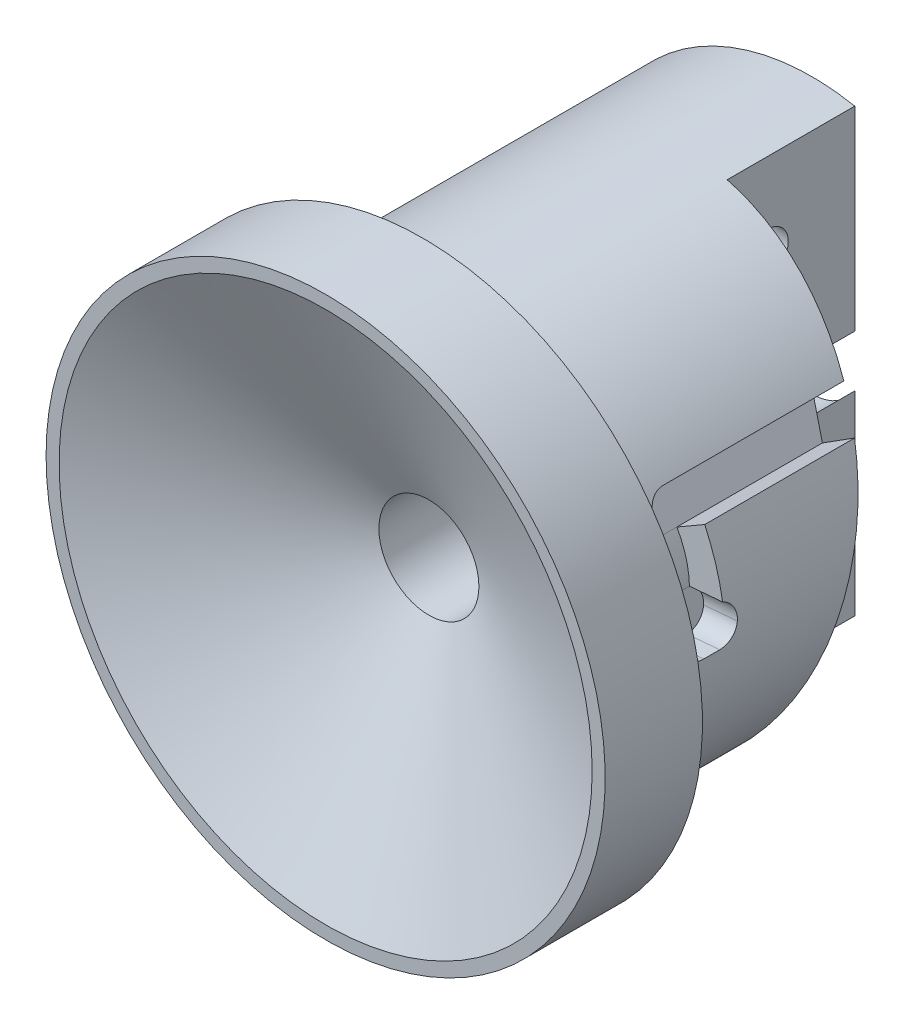
ISO-10303-21;
HEADER;
FILE_DESCRIPTION(('STEP AP214'),'2;1');
FILE_NAME('part.step','',(''),(''),'','','');
FILE_SCHEMA(('AUTOMOTIVE_DESIGN { 1 0 10303 214 1 1 1 1 }'));
ENDSEC;
DATA;
#1=APPLICATION_CONTEXT('core data for automotive mechanical design processes');
#2=APPLICATION_PROTOCOL_DEFINITION('international standard','automotive_design',2000,#1);
#3=PRODUCT_CONTEXT('',#1,'mechanical');
#4=PRODUCT('Part','Part','',(#3));
#5=PRODUCT_RELATED_PRODUCT_CATEGORY('part','',(#4));
#6=PRODUCT_DEFINITION_FORMATION('','',#4);
#7=PRODUCT_DEFINITION_CONTEXT('part definition',#1,'design');
#8=PRODUCT_DEFINITION('design','',#6,#7);
#9=PRODUCT_DEFINITION_SHAPE('','',#8);
#10=(LENGTH_UNIT() NAMED_UNIT(*) SI_UNIT(.MILLI.,.METRE.));
#11=(NAMED_UNIT(*) PLANE_ANGLE_UNIT() SI_UNIT($,.RADIAN.));
#12=(NAMED_UNIT(*) SI_UNIT($,.STERADIAN.) SOLID_ANGLE_UNIT());
#13=UNCERTAINTY_MEASURE_WITH_UNIT(LENGTH_MEASURE(1.E-05),#10,'distance_accuracy_value','');
#14=(GEOMETRIC_REPRESENTATION_CONTEXT(3) GLOBAL_UNCERTAINTY_ASSIGNED_CONTEXT((#13)) GLOBAL_UNIT_ASSIGNED_CONTEXT((#10,
#11,#12)) REPRESENTATION_CONTEXT('',''));
#15=CARTESIAN_POINT('',(0.,0.,0.));
#16=DIRECTION('',(0.,0.,1.));
#17=DIRECTION('',(1.,0.,0.));
#18=AXIS2_PLACEMENT_3D('',#15,#16,#17);
#19=CARTESIAN_POINT('',(12.4163792441114,1.08629242589841,-11.43));
#20=DIRECTION('',(-0.996194698091745,-0.0871557427476648,0.));
#21=DIRECTION('',(0.0871557427476648,-0.996194698091745,0.));
#22=AXIS2_PLACEMENT_3D('',#19,#20,#21);
#23=PLANE('',#22);
#24=DIRECTION('',(0.,0.,1.));
#25=VECTOR('',#24,1.);
#26=CARTESIAN_POINT('',(12.5303876711996,-0.216829858675404,-11.43));
#27=LINE('',#26,#25);
#28=CARTESIAN_POINT('',(12.5303876711996,-0.216829858675404,-11.0477431507776));
#29=VERTEX_POINT('',#28);
#30=CARTESIAN_POINT('',(12.5303876711996,-0.216829858675404,-10.0076));
#31=VERTEX_POINT('',#30);
#32=EDGE_CURVE('E184',#29,#31,#27,.T.);
#33=ORIENTED_EDGE('',*,*,#32,.F.);
#34=CARTESIAN_POINT('',(12.4263411455075,0.972427371906513,-11.0477431507776));
#35=DIRECTION('',(-0.996194698091745,-0.0871557427476648,0.));
#36=DIRECTION('',(0.0871557427476648,-0.996194698091745,0.));
#37=AXIS2_PLACEMENT_3D('',#34,#35,#36);
#38=CIRCLE('',#37,1.1938);
#39=CARTESIAN_POINT('',(12.4417284972035,0.796549137220463,-12.2284160588988));
#40=VERTEX_POINT('',#39);
#41=EDGE_CURVE('E60',#29,#40,#38,.F.);
#42=ORIENTED_EDGE('',*,*,#41,.T.);
#43=CARTESIAN_POINT('',(12.4248678884302,0.989266777355177,-10.9347));
#44=DIRECTION('',(0.996194698091745,0.0871557427476654,0.));
#45=DIRECTION('',(-0.0871557427476654,0.996194698091745,0.));
#46=AXIS2_PLACEMENT_3D('',#43,#44,#45);
#47=CIRCLE('',#46,1.3081);
#48=CARTESIAN_POINT('',(12.3193481056608,2.19536341338579,-11.43));
#49=VERTEX_POINT('',#48);
#50=EDGE_CURVE('E178',#40,#49,#47,.T.);
#51=ORIENTED_EDGE('',*,*,#50,.T.);
#52=DIRECTION('',(0.,0.,-1.));
#53=VECTOR('',#52,1.);
#54=CARTESIAN_POINT('',(12.3193481056608,2.19536341338579,-4.98224669027091));
#55=LINE('',#54,#53);
#56=CARTESIAN_POINT('',(12.3193481056608,2.19536341338579,-8.8138));
#57=VERTEX_POINT('',#56);
#58=EDGE_CURVE('E625',#57,#49,#55,.T.);
#59=ORIENTED_EDGE('',*,*,#58,.F.);
#60=DIRECTION('',(0.0871557427476648,-0.996194698091745,0.));
#61=VECTOR('',#60,1.);
#62=CARTESIAN_POINT('',(12.4163792441114,1.08629242589841,-8.8138));
#63=LINE('',#62,#61);
#64=CARTESIAN_POINT('',(12.4263411455075,0.972427371906522,-8.8138));
#65=VERTEX_POINT('',#64);
#66=EDGE_CURVE('E169',#57,#65,#63,.T.);
#67=ORIENTED_EDGE('',*,*,#66,.T.);
#68=CARTESIAN_POINT('',(12.4263411455075,0.972427371906522,-10.0076));
#69=DIRECTION('',(-0.996194698091745,-0.0871557427476648,0.));
#70=DIRECTION('',(0.0871557427476648,-0.996194698091745,0.));
#71=AXIS2_PLACEMENT_3D('',#68,#69,#70);
#72=CIRCLE('',#71,1.1938);
#73=EDGE_CURVE('E285',#65,#31,#72,.F.);
#74=ORIENTED_EDGE('',*,*,#73,.T.);
#75=EDGE_LOOP('',(#33,#42,#51,#59,#67,#74));
#76=FACE_BOUND('',#75,.T.);
#77=ADVANCED_FACE('F46',(#76),#23,.F.);
#78=CARTESIAN_POINT('',(0.,0.,-0.325495880631441));
#79=DIRECTION('',(0.,0.,-1.));
#80=DIRECTION('',(-1.,0.,0.));
#81=AXIS2_PLACEMENT_3D('',#78,#79,#80);
#82=CYLINDRICAL_SURFACE('',#81,14.6812);
#83=CARTESIAN_POINT('',(0.,0.,-6.35));
#84=DIRECTION('',(0.,0.,-1.));
#85=DIRECTION('',(-1.,0.,0.));
#86=AXIS2_PLACEMENT_3D('',#83,#84,#85);
#87=CIRCLE('',#86,14.6812);
#88=CARTESIAN_POINT('',(-14.6812,0.,-6.35));
#89=VERTEX_POINT('',#88);
#90=EDGE_CURVE('E246',#89,#89,#87,.T.);
#91=ORIENTED_EDGE('',*,*,#90,.T.);
#92=EDGE_LOOP('',(#91));
#93=FACE_BOUND('',#92,.T.);
#94=CARTESIAN_POINT('',(0.,0.,-11.43));
#95=DIRECTION('',(0.,0.,-1.));
#96=DIRECTION('',(-1.,0.,0.));
#97=AXIS2_PLACEMENT_3D('',#94,#95,#96);
#98=CIRCLE('',#97,14.6812);
#99=CARTESIAN_POINT('',(13.3177730257338,6.17855606715985,-11.43));
#100=VERTEX_POINT('',#99);
#101=CARTESIAN_POINT('',(14.4861901964781,2.3849375319831,-11.43));
#102=VERTEX_POINT('',#101);
#103=EDGE_CURVE('E174',#100,#102,#98,.T.);
#104=ORIENTED_EDGE('',*,*,#103,.T.);
#105=CARTESIAN_POINT('',(14.4861901964781,2.3849375319831,-11.43));
#106=CARTESIAN_POINT('',(14.4884613639518,2.37113892146036,-11.4640839324803));
#107=CARTESIAN_POINT('',(14.4909469978515,2.35592163119562,-11.4975599355647));
#108=CARTESIAN_POINT('',(14.4963016066078,2.32274827648895,-11.5630917175754));
#109=CARTESIAN_POINT('',(14.4991705585478,2.30479237576407,-11.5951475812514));
#110=CARTESIAN_POINT('',(14.5082748069592,2.24702314199613,-11.6887851744347));
#111=CARTESIAN_POINT('',(14.5150150036987,2.2032637948891,-11.7479464938295));
#112=CARTESIAN_POINT('',(14.5293750070234,2.10648592639315,-11.8580031221646));
#113=CARTESIAN_POINT('',(14.5369951813185,2.0534635295405,-11.9088949540572));
#114=CARTESIAN_POINT('',(14.5526203993969,1.93963040528132,-12.0009804680014));
#115=CARTESIAN_POINT('',(14.5606253725657,1.87882110346975,-12.0421759213184));
#116=CARTESIAN_POINT('',(14.576537633485,1.75109152865624,-12.1137040439891));
#117=CARTESIAN_POINT('',(14.5844449014716,1.68417004152981,-12.1440345492142));
#118=CARTESIAN_POINT('',(14.5997272511608,1.54609767566489,-12.1929541419579));
#119=CARTESIAN_POINT('',(14.607102277394,1.47494635750507,-12.2115420072372));
#120=CARTESIAN_POINT('',(14.6209501884581,1.33066995216013,-12.2363920347503));
#121=CARTESIAN_POINT('',(14.6274258299262,1.25755175459766,-12.2426926683214));
#122=CARTESIAN_POINT('',(14.6392703996066,1.11120858960278,-12.2429046032492));
#123=CARTESIAN_POINT('',(14.6446393414138,1.03798362349305,-12.2368160568067));
#124=CARTESIAN_POINT('',(14.6541548947385,0.893645242462607,-12.2124528028116));
#125=CARTESIAN_POINT('',(14.6583036793869,0.822528278854515,-12.1941999519649));
#126=CARTESIAN_POINT('',(14.6654071916949,0.684294374417719,-12.1460628447409));
#127=CARTESIAN_POINT('',(14.6683620518004,0.61717699060737,-12.1161798792521));
#128=CARTESIAN_POINT('',(14.6732064954826,0.488666124884252,-12.0455416585469));
#129=CARTESIAN_POINT('',(14.6750933912915,0.427287406482897,-12.0047593487301));
#130=CARTESIAN_POINT('',(14.6779937408499,0.312178358820198,-11.9135124207659));
#131=CARTESIAN_POINT('',(14.6790070080101,0.258449665492134,-11.8630457370473));
#132=CARTESIAN_POINT('',(14.6804218904452,0.159245895251082,-11.7527841678264));
#133=CARTESIAN_POINT('',(14.680811807414,0.113942466276904,-11.692833569748));
#134=CARTESIAN_POINT('',(14.6811136624675,0.0541648994216365,-11.5978162464266));
#135=CARTESIAN_POINT('',(14.6811670302523,0.0355888327049288,-11.5652633572206));
#136=CARTESIAN_POINT('',(14.6812098056202,0.00129355360213024,-11.498683736804));
#137=CARTESIAN_POINT('',(14.6811992098185,-0.014425507549017,-11.4646569276898));
#138=CARTESIAN_POINT('',(14.6811720243797,-0.028660610083196,-11.43));
#139=B_SPLINE_CURVE_WITH_KNOTS('',3,(#105,#106,#107,#108,#109,#110,#111,#112,#113,#114,#115,
#116,#117,#118,#119,#120,#121,#122,#123,#124,#125,#126,#127,#128,#129,#130,#131,#132,#133,#134,
#135,#136,#137,#138),.UNSPECIFIED.,.F.,.F.,(4,2,2,2,2,2,2,2,2,2,2,2,2,2,2,2,4),(0.,
0.110455309405497,0.22090401826105,0.441450437625067,0.662089350884358,0.882687928062333,
1.10333042064266,1.3239958751392,1.5439693094908,1.76394004148966,1.98351659398571,
2.20306878145643,2.42317109112525,2.64332039849976,2.86755466092752,2.97987594788759,
3.09220317881903),.UNSPECIFIED.);
#140=CARTESIAN_POINT('',(14.6478125129356,0.989556479382784,-12.2284160588988));
#141=VERTEX_POINT('',#140);
#142=EDGE_CURVE('E160',#102,#141,#139,.T.);
#143=ORIENTED_EDGE('',*,*,#142,.T.);
#144=CARTESIAN_POINT('',(14.6478125129356,0.989556479382784,-12.2284160588988));
#145=CARTESIAN_POINT('',(14.6500520617752,0.956414885802688,-12.2234497719461));
#146=CARTESIAN_POINT('',(14.6521625740862,0.923490699329103,-12.2170844377252));
#147=CARTESIAN_POINT('',(14.6561266797544,0.858282230564713,-12.2016024279582));
#148=CARTESIAN_POINT('',(14.6579802900503,0.825997906205256,-12.1924859339349));
#149=CARTESIAN_POINT('',(14.6631521672888,0.730511927722907,-12.1611134422584));
#150=CARTESIAN_POINT('',(14.6660889302212,0.668565530487546,-12.1348175692463));
#151=CARTESIAN_POINT('',(14.6710176288004,0.549922268249114,-12.0722187251337));
#152=CARTESIAN_POINT('',(14.6730091760995,0.493227568624937,-12.0359116505367));
#153=CARTESIAN_POINT('',(14.6762031903628,0.38669701296365,-11.9543239944428));
#154=CARTESIAN_POINT('',(14.6774058468479,0.336859511848389,-11.9090455716021));
#155=CARTESIAN_POINT('',(14.6792209558788,0.245374594432259,-11.8106954776694));
#156=CARTESIAN_POINT('',(14.6798323334249,0.203742204744798,-11.7576098133281));
#157=CARTESIAN_POINT('',(14.680671372986,0.129958071030313,-11.6451657160257));
#158=CARTESIAN_POINT('',(14.680898820731,0.0978116293300162,-11.5858037999342));
#159=CARTESIAN_POINT('',(14.6811588607807,0.043971541156054,-11.4625272929247));
#160=CARTESIAN_POINT('',(14.681191469244,0.0222770279981484,-11.3986130799922));
#161=CARTESIAN_POINT('',(14.6812059558936,-0.00998039306510226,-11.268137439148));
#162=CARTESIAN_POINT('',(14.6811879344012,-0.0205652571984908,-11.2015815034751));
#163=CARTESIAN_POINT('',(14.6811735472856,-0.0276040131707234,-11.1057329463568));
#164=CARTESIAN_POINT('',(14.6811706958382,-0.0286684031172335,-11.0767298307041));
#165=CARTESIAN_POINT('',(14.6811720243797,-0.0286606100832027,-11.0477431507776));
#166=B_SPLINE_CURVE_WITH_KNOTS('',3,(#144,#145,#146,#147,#148,#149,#150,#151,#152,#153,#154,
#155,#156,#157,#158,#159,#160,#161,#162,#163,#164,#165),.UNSPECIFIED.,.F.,.F.,(4,2,2,2,2,2,2,2,
2,2,4),(0.,0.100696848378733,0.201387054188759,0.402432056561508,0.603559588185072,
0.804638783804235,1.00608287651422,1.20763935734326,1.40917912203195,1.61031982519953,
1.69730434377564),.UNSPECIFIED.);
#167=CARTESIAN_POINT('',(14.6811720243797,-0.0286606100831969,-11.0477431507776));
#168=VERTEX_POINT('',#167);
#169=EDGE_CURVE('E13',#141,#168,#166,.T.);
#170=ORIENTED_EDGE('',*,*,#169,.T.);
#171=DIRECTION('',(0.,0.,1.));
#172=VECTOR('',#171,1.);
#173=CARTESIAN_POINT('',(14.6811720243797,-0.0286606100831969,-11.43));
#174=LINE('',#173,#172);
#175=CARTESIAN_POINT('',(14.6811720243797,-0.0286606100831969,-10.0076));
#176=VERTEX_POINT('',#175);
#177=EDGE_CURVE('E186',#168,#176,#174,.T.);
#178=ORIENTED_EDGE('',*,*,#177,.T.);
#179=CARTESIAN_POINT('',(14.6811720243797,-0.0286606100831969,-10.0076));
#180=CARTESIAN_POINT('',(14.6811713603819,-0.0286605230438289,-9.97408563546251));
#181=CARTESIAN_POINT('',(14.6811748663989,-0.0272427717737959,-9.94058738885749));
#182=CARTESIAN_POINT('',(14.6811845304353,-0.0215876829205685,-9.8738318693208));
#183=CARTESIAN_POINT('',(14.68119068829,-0.0173505205160749,-9.84057458154739));
#184=CARTESIAN_POINT('',(14.6812045930233,-0.000453664150254155,-9.74159048510479));
#185=CARTESIAN_POINT('',(14.6812078098013,0.0163915308899458,-9.67652869935269));
#186=CARTESIAN_POINT('',(14.6810908383812,0.0607567027563818,-9.55016116036319));
#187=CARTESIAN_POINT('',(14.6809705991541,0.0882810907647501,-9.48885697138397));
#188=CARTESIAN_POINT('',(14.6804363890432,0.153200837694031,-9.37172124193255));
#189=CARTESIAN_POINT('',(14.6800224525708,0.190595039879959,-9.31588906119583));
#190=CARTESIAN_POINT('',(14.6786972688968,0.274281353774743,-9.21113424513901));
#191=CARTESIAN_POINT('',(14.6777848159165,0.320594862330806,-9.16222872618486));
#192=CARTESIAN_POINT('',(14.6752549436024,0.42074894096606,-9.07284954191489));
#193=CARTESIAN_POINT('',(14.6736373854947,0.474590991341006,-9.03237753874161));
#194=CARTESIAN_POINT('',(14.6695155823306,0.588380160054187,-8.96094395595983));
#195=CARTESIAN_POINT('',(14.6670094195741,0.648340280904667,-8.93000321783209));
#196=CARTESIAN_POINT('',(14.6609910764105,0.772547009819359,-8.87865031721457));
#197=CARTESIAN_POINT('',(14.6574795068623,0.836790996991481,-8.85823178273492));
#198=CARTESIAN_POINT('',(14.6507889416689,0.945461627073592,-8.83354305630054));
#199=CARTESIAN_POINT('',(14.6479009496125,0.989221128629121,-8.82614487763141));
#200=CARTESIAN_POINT('',(14.6416949748365,1.07720193868941,-8.81627361018692));
#201=CARTESIAN_POINT('',(14.6383775752617,1.12142254745402,-8.81379391522364));
#202=CARTESIAN_POINT('',(14.6348522499863,1.16564705681955,-8.8138));
#203=B_SPLINE_CURVE_WITH_KNOTS('',3,(#179,#180,#181,#182,#183,#184,#185,#186,#187,#188,#189,
#190,#191,#192,#193,#194,#195,#196,#197,#198,#199,#200,#201,#202),.UNSPECIFIED.,.F.,.F.,(4,2,2,
2,2,2,2,2,2,2,2,4),(0.,0.10048113671173,0.200956030803738,0.401542288075423,0.602211488518851,
0.8028571811141,1.00399034458768,1.20516311152662,1.40677269924674,1.60826005322121,
1.74142420625145,1.87440938039694),.UNSPECIFIED.);
#204=CARTESIAN_POINT('',(14.6348522499863,1.16564705681955,-8.8138));
#205=VERTEX_POINT('',#204);
#206=EDGE_CURVE('E295',#176,#205,#203,.T.);
#207=ORIENTED_EDGE('',*,*,#206,.T.);
#208=CARTESIAN_POINT('',(0.,0.,-8.8138));
#209=DIRECTION('',(0.,0.,-1.));
#210=DIRECTION('',(-1.,0.,0.));
#211=AXIS2_PLACEMENT_3D('',#208,#209,#210);
#212=CIRCLE('',#211,14.6812);
#213=CARTESIAN_POINT('',(12.6567568233372,7.43936423055812,-8.8138));
#214=VERTEX_POINT('',#213);
#215=EDGE_CURVE('E198',#205,#214,#212,.F.);
#216=ORIENTED_EDGE('',*,*,#215,.T.);
#217=CARTESIAN_POINT('',(12.6567568233372,7.43936423055812,-8.8138));
#218=CARTESIAN_POINT('',(12.6397597788737,7.46828295212252,-8.81380015810687));
#219=CARTESIAN_POINT('',(12.6226705774063,7.49712876306233,-8.8152145949507));
#220=CARTESIAN_POINT('',(12.5884195945533,7.55449792981282,-8.82085647503839));
#221=CARTESIAN_POINT('',(12.5712578177808,7.58302130570696,-8.82508374208702));
#222=CARTESIAN_POINT('',(12.5198894231226,7.66774696235313,-8.84194156904666));
#223=CARTESIAN_POINT('',(12.4857380361821,7.72320965707814,-8.8587482841184));
#224=CARTESIAN_POINT('',(12.4187154652752,7.83052717895543,-8.90302146476721));
#225=CARTESIAN_POINT('',(12.3858448136072,7.88238051288315,-8.93049231164126));
#226=CARTESIAN_POINT('',(12.322454656725,7.98111440689049,-8.99530765608452));
#227=CARTESIAN_POINT('',(12.2919348705147,8.02799556154164,-9.03265097123783));
#228=CARTESIAN_POINT('',(12.2342228425561,8.11567569488978,-9.11625205562751));
#229=CARTESIAN_POINT('',(12.2070382409144,8.15646075385226,-9.16252968986431));
#230=CARTESIAN_POINT('',(12.1570375594092,8.23080088923721,-9.26265484131266));
#231=CARTESIAN_POINT('',(12.1342223196209,8.26435457547542,-9.31650381078207));
#232=CARTESIAN_POINT('',(12.0937823150095,8.32342180353166,-9.43031977384777));
#233=CARTESIAN_POINT('',(12.0761645636817,8.34892448453775,-9.49029488857362));
#234=CARTESIAN_POINT('',(12.0468408632733,8.39118133972652,-9.61459598954198));
#235=CARTESIAN_POINT('',(12.0351312922353,8.40794087403206,-9.6789192826759));
#236=CARTESIAN_POINT('',(12.0209857473769,8.4281451550881,-9.7876294569824));
#237=CARTESIAN_POINT('',(12.0167485960115,8.43418213385462,-9.83132608869502));
#238=CARTESIAN_POINT('',(12.0110913581152,8.44223457874028,-9.91920886554014));
#239=CARTESIAN_POINT('',(12.0096674778834,8.44425546059445,-9.96339427054197));
#240=CARTESIAN_POINT('',(12.0096730257338,8.4442517285407,-10.0076));
#241=B_SPLINE_CURVE_WITH_KNOTS('',3,(#217,#218,#219,#220,#221,#222,#223,#224,#225,#226,#227,
#228,#229,#230,#231,#232,#233,#234,#235,#236,#237,#238,#239,#240),.UNSPECIFIED.,.F.,.F.,(4,2,2,
2,2,2,2,2,2,2,2,4),(0.,0.100569590039991,0.201132881010322,0.401899054356789,0.60274779877107,
0.80357249861645,1.00484897434578,1.20616410971808,1.40774967022183,1.6092114998785,
1.74189925108982,1.87440795018741),.UNSPECIFIED.);
#242=CARTESIAN_POINT('',(12.0096730257338,8.4442517285407,-10.0076));
#243=VERTEX_POINT('',#242);
#244=EDGE_CURVE('E288',#214,#243,#241,.T.);
#245=ORIENTED_EDGE('',*,*,#244,.T.);
#246=DIRECTION('',(0.,0.,-1.));
#247=VECTOR('',#246,1.);
#248=CARTESIAN_POINT('',(12.0096730257338,8.4442517285407,-1.79195968761566));
#249=LINE('',#248,#247);
#250=CARTESIAN_POINT('',(12.0096730257338,8.4442517285407,-21.8195100609629));
#251=VERTEX_POINT('',#250);
#252=EDGE_CURVE('E199',#243,#251,#249,.T.);
#253=ORIENTED_EDGE('',*,*,#252,.T.);
#254=CARTESIAN_POINT('',(0.,0.,-19.5568796296153));
#255=DIRECTION('',(0.,0.258819045102522,0.965925826289068));
#256=DIRECTION('',(0.,0.965925826289068,-0.258819045102522));
#257=AXIS2_PLACEMENT_3D('',#254,#255,#256);
#258=ELLIPSE('',#257,15.1990966598365,14.6812);
#259=CARTESIAN_POINT('',(2.794,14.412883037061,-23.4188));
#260=VERTEX_POINT('',#259);
#261=EDGE_CURVE('E258',#260,#251,#258,.F.);
#262=ORIENTED_EDGE('',*,*,#261,.F.);
#263=DIRECTION('',(0.,0.,-1.));
#264=VECTOR('',#263,1.);
#265=CARTESIAN_POINT('',(2.794,14.412883037061,-23.4188));
#266=LINE('',#265,#264);
#267=CARTESIAN_POINT('',(2.794,14.412883037061,-31.75));
#268=VERTEX_POINT('',#267);
#269=EDGE_CURVE('E221',#260,#268,#266,.T.);
#270=ORIENTED_EDGE('',*,*,#269,.T.);
#271=CARTESIAN_POINT('',(0.,0.,-31.75));
#272=DIRECTION('',(0.,0.,-1.));
#273=DIRECTION('',(-1.,0.,0.));
#274=AXIS2_PLACEMENT_3D('',#271,#272,#273);
#275=CIRCLE('',#274,14.6812);
#276=CARTESIAN_POINT('',(2.794,-14.412883037061,-31.75));
#277=VERTEX_POINT('',#276);
#278=EDGE_CURVE('E249',#277,#268,#275,.T.);
#279=ORIENTED_EDGE('',*,*,#278,.F.);
#280=DIRECTION('',(0.,0.,1.));
#281=VECTOR('',#280,1.);
#282=CARTESIAN_POINT('',(2.794,-14.412883037061,-31.75));
#283=LINE('',#282,#281);
#284=CARTESIAN_POINT('',(2.794,-14.412883037061,-15.6949592592305));
#285=VERTEX_POINT('',#284);
#286=EDGE_CURVE('E214',#277,#285,#283,.T.);
#287=ORIENTED_EDGE('',*,*,#286,.T.);
#288=CARTESIAN_POINT('',(13.3177730257338,6.17855606715985,-21.2124187382012));
#289=VERTEX_POINT('',#288);
#290=EDGE_CURVE('E255',#289,#285,#258,.F.);
#291=ORIENTED_EDGE('',*,*,#290,.F.);
#292=DIRECTION('',(0.,0.,-1.));
#293=VECTOR('',#292,1.);
#294=CARTESIAN_POINT('',(13.3177730257338,6.17855606715985,-1.79195968761566));
#295=LINE('',#294,#293);
#296=EDGE_CURVE('E183',#100,#289,#295,.T.);
#297=ORIENTED_EDGE('',*,*,#296,.F.);
#298=EDGE_LOOP('',(#104,#143,#170,#178,#207,#216,#245,#253,#262,#270,#279,#287,#291,#297));
#299=FACE_BOUND('',#298,.T.);
#300=ADVANCED_FACE('F181',(#93,#299),#82,.T.);
#301=CARTESIAN_POINT('',(0.,0.,-11.43));
#302=DIRECTION('',(0.,0.,-1.));
#303=DIRECTION('',(-1.,0.,0.));
#304=AXIS2_PLACEMENT_3D('',#301,#302,#303);
#305=PLANE('',#304);
#306=CARTESIAN_POINT('',(6.18343536424458,2.05954429780938,-11.43));
#307=DIRECTION('',(0.,0.,1.));
#308=DIRECTION('',(1.,0.,0.));
#309=AXIS2_PLACEMENT_3D('',#306,#307,#308);
#310=CIRCLE('',#309,6.13741574300042);
#311=CARTESIAN_POINT('',(11.4985933112695,5.12825216930959,-11.43));
#312=VERTEX_POINT('',#311);
#313=EDGE_CURVE('E177',#49,#312,#310,.T.);
#314=ORIENTED_EDGE('',*,*,#313,.F.);
#315=DIRECTION('',(-0.996194698091745,-0.0871557427476654,0.));
#316=VECTOR('',#315,1.);
#317=CARTESIAN_POINT('',(19.5987713062001,2.8322304204406,-11.43));
#318=LINE('',#317,#316);
#319=EDGE_CURVE('E164',#102,#49,#318,.T.);
#320=ORIENTED_EDGE('',*,*,#319,.F.);
#321=ORIENTED_EDGE('',*,*,#103,.F.);
#322=DIRECTION('',(0.866025403784438,0.500000000000001,0.));
#323=VECTOR('',#322,1.);
#324=CARTESIAN_POINT('',(13.3177730257338,6.17855606715985,-11.43));
#325=LINE('',#324,#323);
#326=EDGE_CURVE('E270',#312,#100,#325,.T.);
#327=ORIENTED_EDGE('',*,*,#326,.F.);
#328=EDGE_LOOP('',(#314,#320,#321,#327));
#329=FACE_BOUND('',#328,.T.);
#330=ADVANCED_FACE('F173',(#329),#305,.F.);
#331=CARTESIAN_POINT('',(0.,0.,-0.325495880631441));
#332=DIRECTION('',(0.,0.,-1.));
#333=DIRECTION('',(-1.,0.,0.));
#334=AXIS2_PLACEMENT_3D('',#331,#332,#333);
#335=CYLINDRICAL_SURFACE('',#334,3.2639);
#336=CARTESIAN_POINT('',(0.,0.,-6.74151411678832));
#337=DIRECTION('',(0.,0.,1.));
#338=DIRECTION('',(1.,0.,0.));
#339=AXIS2_PLACEMENT_3D('',#336,#337,#338);
#340=CIRCLE('',#339,3.2639);
#341=CARTESIAN_POINT('',(3.2639,0.,-6.74151411678832));
#342=VERTEX_POINT('',#341);
#343=EDGE_CURVE('E239',#342,#342,#340,.F.);
#344=ORIENTED_EDGE('',*,*,#343,.F.);
#345=EDGE_LOOP('',(#344));
#346=FACE_BOUND('',#345,.T.);
#347=CARTESIAN_POINT('',(0.,0.,-19.5568796296153));
#348=DIRECTION('',(0.,0.258819045102522,0.965925826289068));
#349=DIRECTION('',(0.,0.965925826289068,-0.258819045102522));
#350=AXIS2_PLACEMENT_3D('',#347,#348,#349);
#351=ELLIPSE('',#350,3.37903792524047,3.2639);
#352=CARTESIAN_POINT('',(2.794,-1.68718914470192,-19.1047986608138));
#353=VERTEX_POINT('',#352);
#354=CARTESIAN_POINT('',(2.794,1.68718914470192,-20.0089605984167));
#355=VERTEX_POINT('',#354);
#356=EDGE_CURVE('E234',#353,#355,#351,.T.);
#357=ORIENTED_EDGE('',*,*,#356,.F.);
#358=DIRECTION('',(0.,0.,-1.));
#359=VECTOR('',#358,1.);
#360=CARTESIAN_POINT('',(2.794,-1.68718914470192,-0.325495880631441));
#361=LINE('',#360,#359);
#362=CARTESIAN_POINT('',(2.794,-1.68718914470192,-31.75));
#363=VERTEX_POINT('',#362);
#364=EDGE_CURVE('E231',#353,#363,#361,.T.);
#365=ORIENTED_EDGE('',*,*,#364,.T.);
#366=CARTESIAN_POINT('',(0.,0.,-31.75));
#367=DIRECTION('',(0.,0.,-1.));
#368=DIRECTION('',(-1.,0.,0.));
#369=AXIS2_PLACEMENT_3D('',#366,#367,#368);
#370=CIRCLE('',#369,3.2639);
#371=CARTESIAN_POINT('',(2.794,1.68718914470192,-31.75));
#372=VERTEX_POINT('',#371);
#373=EDGE_CURVE('E252',#363,#372,#370,.T.);
#374=ORIENTED_EDGE('',*,*,#373,.T.);
#375=DIRECTION('',(0.,0.,-1.));
#376=VECTOR('',#375,1.);
#377=CARTESIAN_POINT('',(2.794,1.68718914470192,-0.325495880631441));
#378=LINE('',#377,#376);
#379=EDGE_CURVE('E228',#372,#355,#378,.F.);
#380=ORIENTED_EDGE('',*,*,#379,.T.);
#381=EDGE_LOOP('',(#357,#365,#374,#380));
#382=FACE_BOUND('',#381,.T.);
#383=ADVANCED_FACE('F318',(#346,#382),#335,.F.);
#384=CARTESIAN_POINT('',(0.,3.2639,-31.75));
#385=DIRECTION('',(0.,0.,-1.));
#386=DIRECTION('',(-1.,0.,0.));
#387=AXIS2_PLACEMENT_3D('',#384,#385,#386);
#388=PLANE('',#387);
#389=ORIENTED_EDGE('',*,*,#278,.T.);
#390=DIRECTION('',(0.,-1.,0.));
#391=VECTOR('',#390,1.);
#392=CARTESIAN_POINT('',(2.794,14.412883037061,-31.75));
#393=LINE('',#392,#391);
#394=EDGE_CURVE('E225',#268,#372,#393,.T.);
#395=ORIENTED_EDGE('',*,*,#394,.T.);
#396=ORIENTED_EDGE('',*,*,#373,.F.);
#397=EDGE_CURVE('E224',#363,#277,#393,.T.);
#398=ORIENTED_EDGE('',*,*,#397,.T.);
#399=EDGE_LOOP('',(#389,#395,#396,#398));
#400=FACE_BOUND('',#399,.T.);
#401=ADVANCED_FACE('F311',(#400),#388,.T.);
#402=CARTESIAN_POINT('',(0.,18.2499,0.));
#403=DIRECTION('',(0.,0.,1.));
#404=DIRECTION('',(1.,0.,0.));
#405=AXIS2_PLACEMENT_3D('',#402,#403,#404);
#406=PLANE('',#405);
#407=CARTESIAN_POINT('',(0.,0.,0.));
#408=DIRECTION('',(0.,0.,-1.));
#409=DIRECTION('',(-1.,0.,0.));
#410=AXIS2_PLACEMENT_3D('',#407,#408,#409);
#411=CIRCLE('',#410,17.399);
#412=CARTESIAN_POINT('',(17.399,0.,0.));
#413=VERTEX_POINT('',#412);
#414=EDGE_CURVE('E236',#413,#413,#411,.T.);
#415=ORIENTED_EDGE('',*,*,#414,.T.);
#416=EDGE_LOOP('',(#415));
#417=FACE_BOUND('',#416,.T.);
#418=CARTESIAN_POINT('',(0.,0.,0.));
#419=DIRECTION('',(0.,0.,-1.));
#420=DIRECTION('',(-1.,0.,0.));
#421=AXIS2_PLACEMENT_3D('',#418,#419,#420);
#422=CIRCLE('',#421,18.2499);
#423=CARTESIAN_POINT('',(-18.2499,0.,0.));
#424=VERTEX_POINT('',#423);
#425=EDGE_CURVE('E240',#424,#424,#422,.T.);
#426=ORIENTED_EDGE('',*,*,#425,.F.);
#427=EDGE_LOOP('',(#426));
#428=FACE_BOUND('',#427,.T.);
#429=ADVANCED_FACE('F317',(#417,#428),#406,.T.);
#430=CARTESIAN_POINT('',(0.,14.6812,-6.35));
#431=DIRECTION('',(0.,0.,-1.));
#432=DIRECTION('',(-1.,0.,0.));
#433=AXIS2_PLACEMENT_3D('',#430,#431,#432);
#434=PLANE('',#433);
#435=CARTESIAN_POINT('',(0.,0.,-6.35));
#436=DIRECTION('',(0.,0.,-1.));
#437=DIRECTION('',(-1.,0.,0.));
#438=AXIS2_PLACEMENT_3D('',#435,#436,#437);
#439=CIRCLE('',#438,18.2499);
#440=CARTESIAN_POINT('',(-18.2499,0.,-6.35));
#441=VERTEX_POINT('',#440);
#442=EDGE_CURVE('E243',#441,#441,#439,.T.);
#443=ORIENTED_EDGE('',*,*,#442,.T.);
#444=EDGE_LOOP('',(#443));
#445=FACE_BOUND('',#444,.T.);
#446=ORIENTED_EDGE('',*,*,#90,.F.);
#447=EDGE_LOOP('',(#446));
#448=FACE_BOUND('',#447,.T.);
#449=ADVANCED_FACE('F309',(#445,#448),#434,.T.);
#450=CARTESIAN_POINT('',(0.,0.,-0.325495880631441));
#451=DIRECTION('',(0.,0.,-1.));
#452=DIRECTION('',(-1.,0.,0.));
#453=AXIS2_PLACEMENT_3D('',#450,#451,#452);
#454=CYLINDRICAL_SURFACE('',#453,18.2499);
#455=ORIENTED_EDGE('',*,*,#425,.T.);
#456=EDGE_LOOP('',(#455));
#457=FACE_BOUND('',#456,.T.);
#458=ORIENTED_EDGE('',*,*,#442,.F.);
#459=EDGE_LOOP('',(#458));
#460=FACE_BOUND('',#459,.T.);
#461=ADVANCED_FACE('F327',(#457,#460),#454,.T.);
#462=CARTESIAN_POINT('',(0.,0.,-8.29818));
#463=DIRECTION('',(0.,0.,1.));
#464=DIRECTION('',(1.,0.,0.));
#465=AXIS2_PLACEMENT_3D('',#462,#463,#464);
#466=CONICAL_SURFACE('',#465,0.,1.12577095336052);
#467=CARTESIAN_POINT('',(3.2639,0.,-6.74151411678832));
#468=CARTESIAN_POINT('',(3.411140625,0.,-6.67129001140511));
#469=CARTESIAN_POINT('',(3.55838125,0.,-6.6010659060219));
#470=CARTESIAN_POINT('',(3.8528625,0.,-6.46061769525547));
#471=CARTESIAN_POINT('',(4.000103125,0.,-6.39039358987226));
#472=CARTESIAN_POINT('',(4.294584375,0.,-6.24994537910584));
#473=CARTESIAN_POINT('',(4.441825,0.,-6.17972127372263));
#474=CARTESIAN_POINT('',(4.73630625,0.,-6.0392730629562));
#475=CARTESIAN_POINT('',(4.883546875,0.,-5.96904895757299));
#476=CARTESIAN_POINT('',(5.178028125,0.,-5.82860074680657));
#477=CARTESIAN_POINT('',(5.32526875,0.,-5.75837664142336));
#478=CARTESIAN_POINT('',(5.61975,0.,-5.61792843065693));
#479=CARTESIAN_POINT('',(5.766990625,0.,-5.54770432527372));
#480=CARTESIAN_POINT('',(6.061471875,0.,-5.4072561145073));
#481=CARTESIAN_POINT('',(6.2087125,0.,-5.33703200912409));
#482=CARTESIAN_POINT('',(6.50319375,0.,-5.19658379835766));
#483=CARTESIAN_POINT('',(6.650434375,0.,-5.12635969297445));
#484=CARTESIAN_POINT('',(6.944915625,0.,-4.98591148220803));
#485=CARTESIAN_POINT('',(7.09215625,0.,-4.91568737682482));
#486=CARTESIAN_POINT('',(7.3866375,0.,-4.77523916605839));
#487=CARTESIAN_POINT('',(7.533878125,0.,-4.70501506067518));
#488=CARTESIAN_POINT('',(7.828359375,0.,-4.56456684990876));
#489=CARTESIAN_POINT('',(7.9756,0.,-4.49434274452555));
#490=CARTESIAN_POINT('',(8.27008125,0.,-4.35389453375912));
#491=CARTESIAN_POINT('',(8.417321875,0.,-4.28367042837591));
#492=CARTESIAN_POINT('',(8.711803125,0.,-4.14322221760949));
#493=CARTESIAN_POINT('',(8.85904375,0.,-4.07299811222628));
#494=CARTESIAN_POINT('',(9.153525,0.,-3.93254990145985));
#495=CARTESIAN_POINT('',(9.300765625,0.,-3.86232579607664));
#496=CARTESIAN_POINT('',(9.595246875,0.,-3.72187758531022));
#497=CARTESIAN_POINT('',(9.7424875,0.,-3.65165347992701));
#498=CARTESIAN_POINT('',(10.03696875,0.,-3.51120526916058));
#499=CARTESIAN_POINT('',(10.184209375,0.,-3.44098116377737));
#500=CARTESIAN_POINT('',(10.478690625,0.,-3.30053295301095));
#501=CARTESIAN_POINT('',(10.62593125,0.,-3.23030884762774));
#502=CARTESIAN_POINT('',(10.9204125,0.,-3.08986063686131));
#503=CARTESIAN_POINT('',(11.067653125,0.,-3.0196365314781));
#504=CARTESIAN_POINT('',(11.362134375,0.,-2.87918832071168));
#505=CARTESIAN_POINT('',(11.509375,0.,-2.80896421532847));
#506=CARTESIAN_POINT('',(11.80385625,0.,-2.66851600456204));
#507=CARTESIAN_POINT('',(11.951096875,0.,-2.59829189917883));
#508=CARTESIAN_POINT('',(12.245578125,0.,-2.45784368841241));
#509=CARTESIAN_POINT('',(12.39281875,0.,-2.3876195830292));
#510=CARTESIAN_POINT('',(12.6873,0.,-2.24717137226277));
#511=CARTESIAN_POINT('',(12.834540625,0.,-2.17694726687956));
#512=CARTESIAN_POINT('',(13.129021875,0.,-2.03649905611314));
#513=CARTESIAN_POINT('',(13.2762625,0.,-1.96627495072993));
#514=CARTESIAN_POINT('',(13.57074375,0.,-1.8258267399635));
#515=CARTESIAN_POINT('',(13.717984375,0.,-1.75560263458029));
#516=CARTESIAN_POINT('',(14.012465625,0.,-1.61515442381387));
#517=CARTESIAN_POINT('',(14.15970625,0.,-1.54493031843066));
#518=CARTESIAN_POINT('',(14.4541875,0.,-1.40448210766423));
#519=CARTESIAN_POINT('',(14.601428125,0.,-1.33425800228102));
#520=CARTESIAN_POINT('',(14.895909375,0.,-1.1938097915146));
#521=CARTESIAN_POINT('',(15.04315,0.,-1.12358568613139));
#522=CARTESIAN_POINT('',(15.33763125,0.,-0.983137475364963));
#523=CARTESIAN_POINT('',(15.484871875,0.,-0.912913369981751));
#524=CARTESIAN_POINT('',(15.779353125,0.,-0.772465159215328));
#525=CARTESIAN_POINT('',(15.92659375,0.,-0.702241053832117));
#526=CARTESIAN_POINT('',(16.221075,0.,-0.561792843065693));
#527=CARTESIAN_POINT('',(16.368315625,0.,-0.491568737682481));
#528=CARTESIAN_POINT('',(16.662796875,0.,-0.351120526916057));
#529=CARTESIAN_POINT('',(16.8100375,0.,-0.280896421532846));
#530=CARTESIAN_POINT('',(17.10451875,0.,-0.140448210766423));
#531=CARTESIAN_POINT('',(17.251759375,0.,-0.070224105383211));
#532=CARTESIAN_POINT('',(17.399,0.,0.));
#533=B_SPLINE_CURVE_WITH_KNOTS('',3,(#467,#468,#469,#470,#471,#472,#473,#474,#475,#476,#477,
#478,#479,#480,#481,#482,#483,#484,#485,#486,#487,#488,#489,#490,#491,#492,#493,#494,#495,#496,
#497,#498,#499,#500,#501,#502,#503,#504,#505,#506,#507,#508,#509,#510,#511,#512,#513,#514,#515,
#516,#517,#518,#519,#520,#521,#522,#523,#524,#525,#526,#527,#528,#529,#530,#531,#532),
.UNSPECIFIED.,.F.,.F.,(4,2,2,2,2,2,2,2,2,2,2,2,2,2,2,2,2,2,2,2,2,2,2,2,2,2,2,2,2,2,2,2,4),(0.,
0.489388434319169,0.978776868638338,1.46816530295751,1.95755373727668,2.44694217159584,
2.93633060591501,3.42571904023418,3.91510747455335,4.40449590887252,4.89388434319169,
5.38327277751086,5.87266121183003,6.36204964614919,6.85143808046836,7.34082651478753,
7.8302149491067,8.31960338342587,8.80899181774504,9.29838025206421,9.78776868638338,
10.2771571207025,10.7665455550217,11.2559339893409,11.7453224236601,12.2347108579792,
12.7240992922984,13.2134877266176,13.7028761609367,14.1922645952559,14.6816530295751,
15.1710414638942,15.6604298982134),.UNSPECIFIED.);
#534=EDGE_CURVE('BSEAM373',#342,#413,#533,.T.);
#535=ORIENTED_EDGE('',*,*,#343,.T.);
#536=ORIENTED_EDGE('',*,*,#414,.F.);
#537=ORIENTED_EDGE('',*,*,#534,.T.);
#538=ORIENTED_EDGE('',*,*,#534,.F.);
#539=EDGE_LOOP('',(#535,#537,#536,#538));
#540=FACE_BOUND('',#539,.T.);
#541=ADVANCED_FACE('F373',(#540),#466,.F.);
#542=CARTESIAN_POINT('',(2.794,0.,0.));
#543=DIRECTION('',(1.,0.,0.));
#544=DIRECTION('',(0.,0.,-1.));
#545=AXIS2_PLACEMENT_3D('',#542,#543,#544);
#546=PLANE('',#545);
#547=DIRECTION('',(0.,0.965925826289068,-0.258819045102522));
#548=VECTOR('',#547,1.);
#549=CARTESIAN_POINT('',(2.794,14.412883037061,-23.4188));
#550=LINE('',#549,#548);
#551=EDGE_CURVE('E218',#285,#353,#550,.T.);
#552=ORIENTED_EDGE('',*,*,#551,.F.);
#553=ORIENTED_EDGE('',*,*,#286,.F.);
#554=ORIENTED_EDGE('',*,*,#397,.F.);
#555=ORIENTED_EDGE('',*,*,#364,.F.);
#556=EDGE_LOOP('',(#552,#553,#554,#555));
#557=FACE_BOUND('',#556,.T.);
#558=ADVANCED_FACE('F369',(#557),#546,.T.);
#559=CARTESIAN_POINT('',(18.2499,14.412883037061,-23.4188));
#560=DIRECTION('',(0.,0.258819045102522,0.965925826289068));
#561=DIRECTION('',(0.,-0.965925826289068,0.258819045102522));
#562=AXIS2_PLACEMENT_3D('',#559,#560,#561);
#563=PLANE('',#562);
#564=ORIENTED_EDGE('',*,*,#261,.T.);
#565=DIRECTION('',(-0.858356263574048,-0.49557221983508,0.132788176096109));
#566=VECTOR('',#565,1.);
#567=CARTESIAN_POINT('',(19.3285271655486,12.6697941363224,-22.9517407367114));
#568=LINE('',#567,#566);
#569=CARTESIAN_POINT('',(10.1904933112695,7.39394783069044,-21.5380819797266));
#570=VERTEX_POINT('',#569);
#571=EDGE_CURVE('E267',#251,#570,#568,.T.);
#572=ORIENTED_EDGE('',*,*,#571,.T.);
#573=DIRECTION('',(0.487058473848149,-0.84361002296195,0.226044624379456));
#574=VECTOR('',#573,1.);
#575=CARTESIAN_POINT('',(9.01134034796077,9.43630067303653,-22.0853287744927));
#576=LINE('',#575,#574);
#577=CARTESIAN_POINT('',(11.4985933112695,5.12825216930959,-20.9309906569649));
#578=VERTEX_POINT('',#577);
#579=EDGE_CURVE('E264',#570,#578,#576,.T.);
#580=ORIENTED_EDGE('',*,*,#579,.T.);
#581=DIRECTION('',(0.858356263574048,0.495572219835079,-0.132788176096109));
#582=VECTOR('',#581,1.);
#583=CARTESIAN_POINT('',(20.7058231690242,10.4440488061751,-22.3553540729411));
#584=LINE('',#583,#582);
#585=EDGE_CURVE('E261',#578,#289,#584,.T.);
#586=ORIENTED_EDGE('',*,*,#585,.T.);
#587=ORIENTED_EDGE('',*,*,#290,.T.);
#588=ORIENTED_EDGE('',*,*,#551,.T.);
#589=ORIENTED_EDGE('',*,*,#356,.T.);
#590=EDGE_CURVE('E217',#355,#260,#550,.T.);
#591=ORIENTED_EDGE('',*,*,#590,.T.);
#592=EDGE_LOOP('',(#564,#572,#580,#586,#587,#588,#589,#591));
#593=FACE_BOUND('',#592,.T.);
#594=ADVANCED_FACE('F367',(#593),#563,.F.);
#595=CARTESIAN_POINT('',(2.794,8.9408,-26.0547381065604));
#596=DIRECTION('',(1.,0.,0.));
#597=DIRECTION('',(0.,0.,-1.));
#598=AXIS2_PLACEMENT_3D('',#595,#596,#597);
#599=CIRCLE('',#598,1.35255);
#600=CARTESIAN_POINT('',(2.794,8.9408,-27.4072881065604));
#601=VERTEX_POINT('',#600);
#602=EDGE_CURVE('E202',#601,#601,#599,.T.);
#603=ORIENTED_EDGE('',*,*,#602,.F.);
#604=EDGE_LOOP('',(#603));
#605=FACE_BOUND('',#604,.T.);
#606=ORIENTED_EDGE('',*,*,#394,.F.);
#607=ORIENTED_EDGE('',*,*,#269,.F.);
#608=ORIENTED_EDGE('',*,*,#590,.F.);
#609=ORIENTED_EDGE('',*,*,#379,.F.);
#610=EDGE_LOOP('',(#606,#607,#608,#609));
#611=FACE_BOUND('',#610,.T.);
#612=ADVANCED_FACE('F363',(#605,#611),#546,.T.);
#613=CARTESIAN_POINT('',(-8.1788,8.9408,-26.0547381065604));
#614=DIRECTION('',(1.,0.,0.));
#615=DIRECTION('',(0.,0.,-1.));
#616=AXIS2_PLACEMENT_3D('',#613,#614,#615);
#617=CONICAL_SURFACE('',#616,1.35255,1.02974425867665);
#618=CARTESIAN_POINT('',(-8.99149403026573,8.9408,-26.0547381065604));
#619=VERTEX_POINT('',#618);
#620=VERTEX_LOOP('',#619);
#621=FACE_BOUND('',#620,.T.);
#622=CARTESIAN_POINT('',(-8.1788,8.9408,-26.0547381065604));
#623=DIRECTION('',(1.,0.,0.));
#624=DIRECTION('',(0.,0.,-1.));
#625=AXIS2_PLACEMENT_3D('',#622,#623,#624);
#626=CIRCLE('',#625,1.35255);
#627=CARTESIAN_POINT('',(-8.1788,8.9408,-27.4072881065604));
#628=VERTEX_POINT('',#627);
#629=EDGE_CURVE('E211',#628,#628,#626,.T.);
#630=ORIENTED_EDGE('',*,*,#629,.T.);
#631=EDGE_LOOP('',(#630));
#632=FACE_BOUND('',#631,.T.);
#633=ADVANCED_FACE('F359',(#621,#632),#617,.F.);
#634=CARTESIAN_POINT('',(2.794,8.9408,-26.0547381065604));
#635=DIRECTION('',(1.,0.,0.));
#636=DIRECTION('',(0.,0.,-1.));
#637=AXIS2_PLACEMENT_3D('',#634,#635,#636);
#638=CYLINDRICAL_SURFACE('',#637,1.35255);
#639=ORIENTED_EDGE('',*,*,#629,.F.);
#640=EDGE_LOOP('',(#639));
#641=FACE_BOUND('',#640,.T.);
#642=ORIENTED_EDGE('',*,*,#602,.T.);
#643=EDGE_LOOP('',(#642));
#644=FACE_BOUND('',#643,.T.);
#645=ADVANCED_FACE('F349',(#641,#644),#638,.F.);
#646=CARTESIAN_POINT('',(10.1904933112695,7.39394783069043,-1.79195968761566));
#647=DIRECTION('',(-0.500000000000001,0.866025403784438,0.));
#648=DIRECTION('',(-0.866025403784438,-0.500000000000001,0.));
#649=AXIS2_PLACEMENT_3D('',#646,#647,#648);
#650=PLANE('',#649);
#651=ORIENTED_EDGE('',*,*,#252,.F.);
#652=DIRECTION('',(-0.866025403784438,-0.500000000000001,0.));
#653=VECTOR('',#652,1.);
#654=CARTESIAN_POINT('',(10.1904933112695,7.39394783069043,-10.0076));
#655=LINE('',#654,#653);
#656=CARTESIAN_POINT('',(10.1904933112695,7.39394783069043,-10.0076));
#657=VERTEX_POINT('',#656);
#658=EDGE_CURVE('E272',#243,#657,#655,.T.);
#659=ORIENTED_EDGE('',*,*,#658,.T.);
#660=DIRECTION('',(0.,0.,-1.));
#661=VECTOR('',#660,1.);
#662=CARTESIAN_POINT('',(10.1904933112695,7.39394783069043,-1.79195968761566));
#663=LINE('',#662,#661);
#664=EDGE_CURVE('E204',#657,#570,#663,.T.);
#665=ORIENTED_EDGE('',*,*,#664,.T.);
#666=ORIENTED_EDGE('',*,*,#571,.F.);
#667=EDGE_LOOP('',(#651,#659,#665,#666));
#668=FACE_BOUND('',#667,.T.);
#669=ADVANCED_FACE('F345',(#668),#650,.F.);
#670=CARTESIAN_POINT('',(11.4985933112695,5.12825216930959,-1.79195968761566));
#671=DIRECTION('',(-0.866025403784438,-0.500000000000001,0.));
#672=DIRECTION('',(0.500000000000001,-0.866025403784438,0.));
#673=AXIS2_PLACEMENT_3D('',#670,#671,#672);
#674=PLANE('',#673);
#675=DIRECTION('',(0.,0.,-1.));
#676=VECTOR('',#675,1.);
#677=CARTESIAN_POINT('',(11.4985933112695,5.12825216930959,-4.98224669027091));
#678=LINE('',#677,#676);
#679=CARTESIAN_POINT('',(11.4985933112695,5.12825216930959,-8.8138));
#680=VERTEX_POINT('',#679);
#681=EDGE_CURVE('E630',#680,#312,#678,.T.);
#682=ORIENTED_EDGE('',*,*,#681,.T.);
#683=DIRECTION('',(0.,0.,-1.));
#684=VECTOR('',#683,1.);
#685=CARTESIAN_POINT('',(11.4985933112695,5.12825216930959,-1.79195968761566));
#686=LINE('',#685,#684);
#687=EDGE_CURVE('E206',#312,#578,#686,.T.);
#688=ORIENTED_EDGE('',*,*,#687,.T.);
#689=ORIENTED_EDGE('',*,*,#579,.F.);
#690=ORIENTED_EDGE('',*,*,#664,.F.);
#691=CARTESIAN_POINT('',(10.7873933112695,6.36008670365257,-10.0076));
#692=DIRECTION('',(-0.866025403784438,-0.500000000000001,0.));
#693=DIRECTION('',(0.500000000000001,-0.866025403784438,0.));
#694=AXIS2_PLACEMENT_3D('',#691,#692,#693);
#695=CIRCLE('',#694,1.1938);
#696=CARTESIAN_POINT('',(10.7873933112695,6.36008670365257,-8.8138));
#697=VERTEX_POINT('',#696);
#698=EDGE_CURVE('E275',#657,#697,#695,.F.);
#699=ORIENTED_EDGE('',*,*,#698,.T.);
#700=DIRECTION('',(0.500000000000001,-0.866025403784438,0.));
#701=VECTOR('',#700,1.);
#702=CARTESIAN_POINT('',(11.4985933112695,5.12825216930959,-8.8138));
#703=LINE('',#702,#701);
#704=EDGE_CURVE('E196',#697,#680,#703,.T.);
#705=ORIENTED_EDGE('',*,*,#704,.T.);
#706=EDGE_LOOP('',(#682,#688,#689,#690,#699,#705));
#707=FACE_BOUND('',#706,.T.);
#708=ADVANCED_FACE('F348',(#707),#674,.F.);
#709=CARTESIAN_POINT('',(13.3177730257338,6.17855606715985,-1.79195968761566));
#710=DIRECTION('',(0.500000000000001,-0.866025403784438,0.));
#711=DIRECTION('',(0.866025403784438,0.500000000000001,0.));
#712=AXIS2_PLACEMENT_3D('',#709,#710,#711);
#713=PLANE('',#712);
#714=ORIENTED_EDGE('',*,*,#687,.F.);
#715=ORIENTED_EDGE('',*,*,#326,.T.);
#716=ORIENTED_EDGE('',*,*,#296,.T.);
#717=ORIENTED_EDGE('',*,*,#585,.F.);
#718=EDGE_LOOP('',(#714,#715,#716,#717));
#719=FACE_BOUND('',#718,.T.);
#720=ADVANCED_FACE('F343',(#719),#713,.F.);
#721=CARTESIAN_POINT('',(0.,14.6812,-8.8138));
#722=DIRECTION('',(0.,0.,-1.));
#723=DIRECTION('',(-1.,0.,0.));
#724=AXIS2_PLACEMENT_3D('',#721,#722,#723);
#725=PLANE('',#724);
#726=CARTESIAN_POINT('',(6.18343536424458,2.05954429780938,-8.8138));
#727=DIRECTION('',(0.,0.,-1.));
#728=DIRECTION('',(-1.,0.,0.));
#729=AXIS2_PLACEMENT_3D('',#726,#727,#728);
#730=CIRCLE('',#729,6.13741574300042);
#731=EDGE_CURVE('E627',#680,#57,#730,.T.);
#732=ORIENTED_EDGE('',*,*,#731,.F.);
#733=ORIENTED_EDGE('',*,*,#704,.F.);
#734=DIRECTION('',(-0.866025403784438,-0.500000000000001,0.));
#735=VECTOR('',#734,1.);
#736=CARTESIAN_POINT('',(6.29999607902006,3.76928670365258,-8.8138));
#737=LINE('',#736,#735);
#738=EDGE_CURVE('E280',#697,#214,#737,.F.);
#739=ORIENTED_EDGE('',*,*,#738,.T.);
#740=ORIENTED_EDGE('',*,*,#215,.F.);
#741=DIRECTION('',(0.996194698091745,0.0871557427476641,0.));
#742=VECTOR('',#741,1.);
#743=CARTESIAN_POINT('',(1.28464371437801,-0.00234484575328299,-8.8138));
#744=LINE('',#743,#742);
#745=EDGE_CURVE('E277',#205,#65,#744,.F.);
#746=ORIENTED_EDGE('',*,*,#745,.T.);
#747=ORIENTED_EDGE('',*,*,#66,.F.);
#748=EDGE_LOOP('',(#732,#733,#739,#740,#746,#747));
#749=FACE_BOUND('',#748,.T.);
#750=ADVANCED_FACE('F340',(#749),#725,.T.);
#751=CARTESIAN_POINT('',(0.114008427088219,-1.30312228457381,-11.43));
#752=DIRECTION('',(0.0871557427476641,-0.996194698091745,0.));
#753=DIRECTION('',(0.996194698091745,0.0871557427476641,0.));
#754=AXIS2_PLACEMENT_3D('',#751,#752,#753);
#755=PLANE('',#754);
#756=ORIENTED_EDGE('',*,*,#177,.F.);
#757=DIRECTION('',(-0.996194698091745,-0.0871557427476641,0.));
#758=VECTOR('',#757,1.);
#759=CARTESIAN_POINT('',(0.114008427088219,-1.30312228457381,-11.0477431507776));
#760=LINE('',#759,#758);
#761=EDGE_CURVE('E72',#168,#29,#760,.T.);
#762=ORIENTED_EDGE('',*,*,#761,.T.);
#763=ORIENTED_EDGE('',*,*,#32,.T.);
#764=DIRECTION('',(0.996194698091745,0.0871557427476641,0.));
#765=VECTOR('',#764,1.);
#766=CARTESIAN_POINT('',(0.114008427088219,-1.30312228457381,-10.0076));
#767=LINE('',#766,#765);
#768=EDGE_CURVE('E282',#31,#176,#767,.T.);
#769=ORIENTED_EDGE('',*,*,#768,.T.);
#770=EDGE_LOOP('',(#756,#762,#763,#769));
#771=FACE_BOUND('',#770,.T.);
#772=ADVANCED_FACE('F337',(#771),#755,.F.);
#773=CARTESIAN_POINT('',(19.7042910889695,1.62613378441002,-10.9347));
#774=DIRECTION('',(-0.996194698091745,-0.0871557427476654,0.));
#775=DIRECTION('',(0.0871557427476654,-0.996194698091745,0.));
#776=AXIS2_PLACEMENT_3D('',#773,#774,#775);
#777=CYLINDRICAL_SURFACE('',#776,1.3081);
#778=ORIENTED_EDGE('',*,*,#50,.F.);
#779=DIRECTION('',(-0.996194698091745,-0.0871557427476654,0.));
#780=VECTOR('',#779,1.);
#781=CARTESIAN_POINT('',(19.7211516977428,1.4334161442753,-12.2284160588988));
#782=LINE('',#781,#780);
#783=EDGE_CURVE('E167',#40,#141,#782,.F.);
#784=ORIENTED_EDGE('',*,*,#783,.T.);
#785=ORIENTED_EDGE('',*,*,#142,.F.);
#786=ORIENTED_EDGE('',*,*,#319,.T.);
#787=EDGE_LOOP('',(#778,#784,#785,#786));
#788=FACE_BOUND('',#787,.T.);
#789=ADVANCED_FACE('F163',(#788),#777,.F.);
#790=CARTESIAN_POINT('',(10.7873933112695,6.36008670365257,-10.0076));
#791=DIRECTION('',(-0.866025403784438,-0.500000000000001,0.));
#792=DIRECTION('',(0.500000000000001,-0.866025403784438,0.));
#793=AXIS2_PLACEMENT_3D('',#790,#791,#792);
#794=CYLINDRICAL_SURFACE('',#793,1.1938);
#795=ORIENTED_EDGE('',*,*,#244,.F.);
#796=ORIENTED_EDGE('',*,*,#738,.F.);
#797=ORIENTED_EDGE('',*,*,#698,.F.);
#798=ORIENTED_EDGE('',*,*,#658,.F.);
#799=EDGE_LOOP('',(#795,#796,#797,#798));
#800=FACE_BOUND('',#799,.T.);
#801=ADVANCED_FACE('F301',(#800),#794,.F.);
#802=CARTESIAN_POINT('',(0.00996190139605781,-0.113865053991884,-10.0076));
#803=DIRECTION('',(0.996194698091745,0.0871557427476641,0.));
#804=DIRECTION('',(-0.0871557427476641,0.996194698091745,0.));
#805=AXIS2_PLACEMENT_3D('',#802,#803,#804);
#806=CYLINDRICAL_SURFACE('',#805,1.1938);
#807=ORIENTED_EDGE('',*,*,#73,.F.);
#808=ORIENTED_EDGE('',*,*,#745,.F.);
#809=ORIENTED_EDGE('',*,*,#206,.F.);
#810=ORIENTED_EDGE('',*,*,#768,.F.);
#811=EDGE_LOOP('',(#807,#808,#809,#810));
#812=FACE_BOUND('',#811,.T.);
#813=ADVANCED_FACE('F452',(#812),#806,.F.);
#814=CARTESIAN_POINT('',(6.18343536424458,2.05954429780938,-4.98224669027091));
#815=DIRECTION('',(0.,0.,-1.));
#816=DIRECTION('',(-1.,0.,0.));
#817=AXIS2_PLACEMENT_3D('',#814,#815,#816);
#818=CYLINDRICAL_SURFACE('',#817,6.13741574300042);
#819=ORIENTED_EDGE('',*,*,#681,.F.);
#820=ORIENTED_EDGE('',*,*,#731,.T.);
#821=ORIENTED_EDGE('',*,*,#58,.T.);
#822=ORIENTED_EDGE('',*,*,#313,.T.);
#823=EDGE_LOOP('',(#819,#820,#821,#822));
#824=FACE_BOUND('',#823,.T.);
#825=ADVANCED_FACE('F459',(#824),#818,.T.);
#826=CARTESIAN_POINT('',(19.7057643460468,1.60929437896135,-11.0477431507776));
#827=DIRECTION('',(-0.996194698091745,-0.0871557427476654,0.));
#828=DIRECTION('',(0.0871557427476654,-0.996194698091745,0.));
#829=AXIS2_PLACEMENT_3D('',#826,#827,#828);
#830=CYLINDRICAL_SURFACE('',#829,1.1938);
#831=ORIENTED_EDGE('',*,*,#41,.F.);
#832=ORIENTED_EDGE('',*,*,#761,.F.);
#833=ORIENTED_EDGE('',*,*,#169,.F.);
#834=ORIENTED_EDGE('',*,*,#783,.F.);
#835=EDGE_LOOP('',(#831,#832,#833,#834));
#836=FACE_BOUND('',#835,.T.);
#837=ADVANCED_FACE('F48',(#836),#830,.F.);
#838=CLOSED_SHELL('',(#77,#300,#330,#383,#401,#429,#449,#461,#541,#558,#594,#612,#633,#645,#669,
#708,#720,#750,#772,#789,#801,#813,#825,#837));
#839=MANIFOLD_SOLID_BREP('B2',#838);
#840=ADVANCED_BREP_SHAPE_REPRESENTATION('',(#18,#839),#14);
#841=SHAPE_DEFINITION_REPRESENTATION(#9,#840);
ENDSEC;
END-ISO-10303-21;
